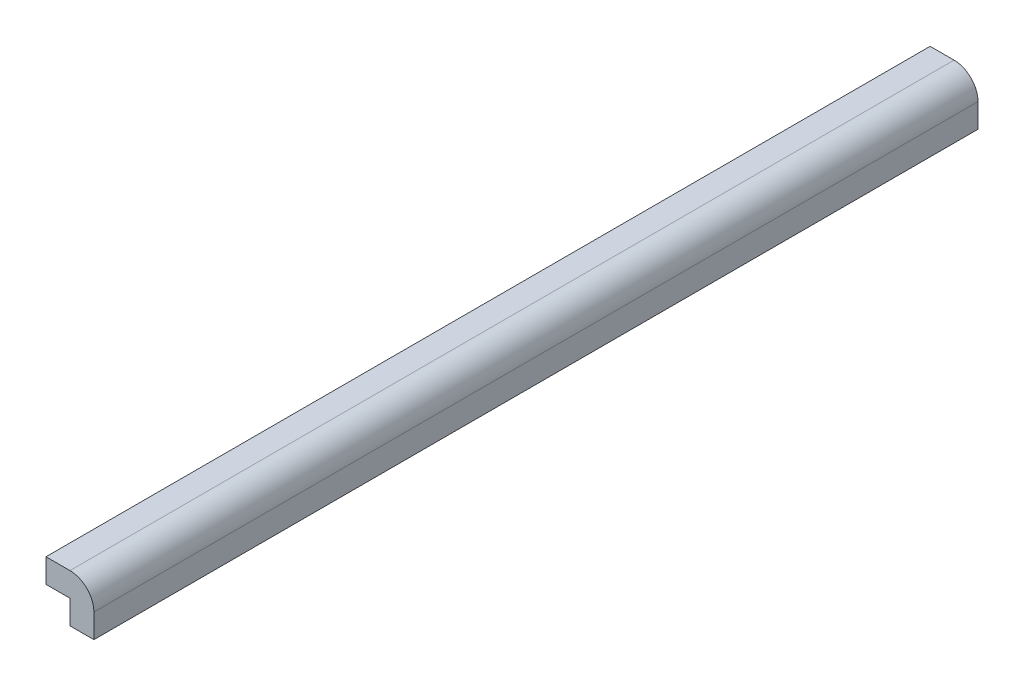
ISO-10303-21;
HEADER;
FILE_DESCRIPTION(('STEP AP214'),'2;1');
FILE_NAME('part.step','',(''),(''),'','','');
FILE_SCHEMA(('AUTOMOTIVE_DESIGN { 1 0 10303 214 1 1 1 1 }'));
ENDSEC;
DATA;
#1=APPLICATION_CONTEXT('core data for automotive mechanical design processes');
#2=APPLICATION_PROTOCOL_DEFINITION('international standard','automotive_design',2000,#1);
#3=PRODUCT_CONTEXT('',#1,'mechanical');
#4=PRODUCT('Part','Part','',(#3));
#5=PRODUCT_RELATED_PRODUCT_CATEGORY('part','',(#4));
#6=PRODUCT_DEFINITION_FORMATION('','',#4);
#7=PRODUCT_DEFINITION_CONTEXT('part definition',#1,'design');
#8=PRODUCT_DEFINITION('design','',#6,#7);
#9=PRODUCT_DEFINITION_SHAPE('','',#8);
#10=(LENGTH_UNIT() NAMED_UNIT(*) SI_UNIT(.MILLI.,.METRE.));
#11=(NAMED_UNIT(*) PLANE_ANGLE_UNIT() SI_UNIT($,.RADIAN.));
#12=(NAMED_UNIT(*) SI_UNIT($,.STERADIAN.) SOLID_ANGLE_UNIT());
#13=UNCERTAINTY_MEASURE_WITH_UNIT(LENGTH_MEASURE(1.E-05),#10,'distance_accuracy_value','');
#14=(GEOMETRIC_REPRESENTATION_CONTEXT(3) GLOBAL_UNCERTAINTY_ASSIGNED_CONTEXT((#13)) GLOBAL_UNIT_ASSIGNED_CONTEXT((#10,
#11,#12)) REPRESENTATION_CONTEXT('',''));
#15=CARTESIAN_POINT('',(0.,0.,0.));
#16=DIRECTION('',(0.,0.,1.));
#17=DIRECTION('',(1.,0.,0.));
#18=AXIS2_PLACEMENT_3D('',#15,#16,#17);
#19=CARTESIAN_POINT('',(0.,0.,480.));
#20=DIRECTION('',(1.,0.,0.));
#21=DIRECTION('',(0.,1.,0.));
#22=AXIS2_PLACEMENT_3D('',#19,#20,#21);
#23=PLANE('',#22);
#24=DIRECTION('',(0.,-1.,0.));
#25=VECTOR('',#24,1.);
#26=CARTESIAN_POINT('',(0.,0.,0.));
#27=LINE('',#26,#25);
#28=CARTESIAN_POINT('',(0.,0.,0.));
#29=VERTEX_POINT('',#28);
#30=CARTESIAN_POINT('',(0.,-13.,0.));
#31=VERTEX_POINT('',#30);
#32=EDGE_CURVE('E129',#29,#31,#27,.T.);
#33=ORIENTED_EDGE('',*,*,#32,.T.);
#34=DIRECTION('',(0.,0.,-1.));
#35=VECTOR('',#34,1.);
#36=CARTESIAN_POINT('',(0.,-13.,480.));
#37=LINE('',#36,#35);
#38=CARTESIAN_POINT('',(0.,-13.,480.));
#39=VERTEX_POINT('',#38);
#40=EDGE_CURVE('E11',#39,#31,#37,.T.);
#41=ORIENTED_EDGE('',*,*,#40,.F.);
#42=DIRECTION('',(0.,-1.,0.));
#43=VECTOR('',#42,1.);
#44=CARTESIAN_POINT('',(0.,0.,480.));
#45=LINE('',#44,#43);
#46=CARTESIAN_POINT('',(0.,0.,480.));
#47=VERTEX_POINT('',#46);
#48=EDGE_CURVE('E141',#47,#39,#45,.T.);
#49=ORIENTED_EDGE('',*,*,#48,.F.);
#50=DIRECTION('',(0.,0.,-1.));
#51=VECTOR('',#50,1.);
#52=CARTESIAN_POINT('',(0.,0.,480.));
#53=LINE('',#52,#51);
#54=EDGE_CURVE('E125',#47,#29,#53,.T.);
#55=ORIENTED_EDGE('',*,*,#54,.T.);
#56=EDGE_LOOP('',(#33,#41,#49,#55));
#57=FACE_BOUND('',#56,.T.);
#58=ADVANCED_FACE('F39',(#57),#23,.F.);
#59=CARTESIAN_POINT('',(0.,-13.,480.));
#60=DIRECTION('',(0.,1.,0.));
#61=DIRECTION('',(0.,0.,1.));
#62=AXIS2_PLACEMENT_3D('',#59,#60,#61);
#63=PLANE('',#62);
#64=DIRECTION('',(1.,0.,0.));
#65=VECTOR('',#64,1.);
#66=CARTESIAN_POINT('',(0.,-13.,0.));
#67=LINE('',#66,#65);
#68=CARTESIAN_POINT('',(13.,-13.,0.));
#69=VERTEX_POINT('',#68);
#70=EDGE_CURVE('E132',#31,#69,#67,.T.);
#71=ORIENTED_EDGE('',*,*,#70,.T.);
#72=DIRECTION('',(0.,0.,-1.));
#73=VECTOR('',#72,1.);
#74=CARTESIAN_POINT('',(13.,-13.,480.));
#75=LINE('',#74,#73);
#76=CARTESIAN_POINT('',(13.,-13.,480.));
#77=VERTEX_POINT('',#76);
#78=EDGE_CURVE('E47',#77,#69,#75,.T.);
#79=ORIENTED_EDGE('',*,*,#78,.F.);
#80=DIRECTION('',(1.,0.,0.));
#81=VECTOR('',#80,1.);
#82=CARTESIAN_POINT('',(0.,-13.,480.));
#83=LINE('',#82,#81);
#84=EDGE_CURVE('E95',#39,#77,#83,.T.);
#85=ORIENTED_EDGE('',*,*,#84,.F.);
#86=ORIENTED_EDGE('',*,*,#40,.T.);
#87=EDGE_LOOP('',(#71,#79,#85,#86));
#88=FACE_BOUND('',#87,.T.);
#89=ADVANCED_FACE('F166',(#88),#63,.F.);
#90=CARTESIAN_POINT('',(13.,0.,480.));
#91=DIRECTION('',(-1.,0.,0.));
#92=DIRECTION('',(0.,-1.,0.));
#93=AXIS2_PLACEMENT_3D('',#90,#91,#92);
#94=PLANE('',#93);
#95=DIRECTION('',(0.,1.,0.));
#96=VECTOR('',#95,1.);
#97=CARTESIAN_POINT('',(13.,0.,0.));
#98=LINE('',#97,#96);
#99=CARTESIAN_POINT('',(13.,0.,0.));
#100=VERTEX_POINT('',#99);
#101=EDGE_CURVE('E134',#69,#100,#98,.T.);
#102=ORIENTED_EDGE('',*,*,#101,.T.);
#103=DIRECTION('',(0.,0.,-1.));
#104=VECTOR('',#103,1.);
#105=CARTESIAN_POINT('',(13.,0.,480.));
#106=LINE('',#105,#104);
#107=CARTESIAN_POINT('',(13.,0.,480.));
#108=VERTEX_POINT('',#107);
#109=EDGE_CURVE('E145',#108,#100,#106,.T.);
#110=ORIENTED_EDGE('',*,*,#109,.F.);
#111=DIRECTION('',(0.,1.,0.));
#112=VECTOR('',#111,1.);
#113=CARTESIAN_POINT('',(13.,0.,480.));
#114=LINE('',#113,#112);
#115=EDGE_CURVE('E153',#77,#108,#114,.T.);
#116=ORIENTED_EDGE('',*,*,#115,.F.);
#117=ORIENTED_EDGE('',*,*,#78,.T.);
#118=EDGE_LOOP('',(#102,#110,#116,#117));
#119=FACE_BOUND('',#118,.T.);
#120=ADVANCED_FACE('F151',(#119),#94,.F.);
#121=CARTESIAN_POINT('',(0.,0.,480.));
#122=DIRECTION('',(0.,0.,-1.));
#123=DIRECTION('',(-1.,0.,0.));
#124=AXIS2_PLACEMENT_3D('',#121,#122,#123);
#125=CYLINDRICAL_SURFACE('',#124,13.);
#126=CARTESIAN_POINT('',(0.,0.,0.));
#127=DIRECTION('',(0.,0.,1.));
#128=DIRECTION('',(-1.,0.,0.));
#129=AXIS2_PLACEMENT_3D('',#126,#127,#128);
#130=CIRCLE('',#129,13.);
#131=CARTESIAN_POINT('',(0.,13.,0.));
#132=VERTEX_POINT('',#131);
#133=EDGE_CURVE('E136',#100,#132,#130,.T.);
#134=ORIENTED_EDGE('',*,*,#133,.T.);
#135=DIRECTION('',(0.,0.,-1.));
#136=VECTOR('',#135,1.);
#137=CARTESIAN_POINT('',(0.,13.,480.));
#138=LINE('',#137,#136);
#139=CARTESIAN_POINT('',(0.,13.,480.));
#140=VERTEX_POINT('',#139);
#141=EDGE_CURVE('E120',#140,#132,#138,.T.);
#142=ORIENTED_EDGE('',*,*,#141,.F.);
#143=CARTESIAN_POINT('',(0.,0.,480.));
#144=DIRECTION('',(0.,0.,1.));
#145=DIRECTION('',(-1.,0.,0.));
#146=AXIS2_PLACEMENT_3D('',#143,#144,#145);
#147=CIRCLE('',#146,13.);
#148=EDGE_CURVE('E111',#108,#140,#147,.T.);
#149=ORIENTED_EDGE('',*,*,#148,.F.);
#150=ORIENTED_EDGE('',*,*,#109,.T.);
#151=EDGE_LOOP('',(#134,#142,#149,#150));
#152=FACE_BOUND('',#151,.T.);
#153=ADVANCED_FACE('F159',(#152),#125,.T.);
#154=CARTESIAN_POINT('',(0.,13.,480.));
#155=DIRECTION('',(0.,-1.,0.));
#156=DIRECTION('',(1.,0.,0.));
#157=AXIS2_PLACEMENT_3D('',#154,#155,#156);
#158=PLANE('',#157);
#159=DIRECTION('',(-1.,0.,0.));
#160=VECTOR('',#159,1.);
#161=CARTESIAN_POINT('',(0.,13.,0.));
#162=LINE('',#161,#160);
#163=CARTESIAN_POINT('',(-13.,13.,0.));
#164=VERTEX_POINT('',#163);
#165=EDGE_CURVE('E119',#132,#164,#162,.T.);
#166=ORIENTED_EDGE('',*,*,#165,.T.);
#167=DIRECTION('',(0.,0.,-1.));
#168=VECTOR('',#167,1.);
#169=CARTESIAN_POINT('',(-13.,13.,480.));
#170=LINE('',#169,#168);
#171=CARTESIAN_POINT('',(-13.,13.,480.));
#172=VERTEX_POINT('',#171);
#173=EDGE_CURVE('E116',#172,#164,#170,.T.);
#174=ORIENTED_EDGE('',*,*,#173,.F.);
#175=DIRECTION('',(-1.,0.,0.));
#176=VECTOR('',#175,1.);
#177=CARTESIAN_POINT('',(0.,13.,480.));
#178=LINE('',#177,#176);
#179=EDGE_CURVE('E105',#140,#172,#178,.T.);
#180=ORIENTED_EDGE('',*,*,#179,.F.);
#181=ORIENTED_EDGE('',*,*,#141,.T.);
#182=EDGE_LOOP('',(#166,#174,#180,#181));
#183=FACE_BOUND('',#182,.T.);
#184=ADVANCED_FACE('F117',(#183),#158,.F.);
#185=CARTESIAN_POINT('',(-13.,0.,480.));
#186=DIRECTION('',(1.,0.,0.));
#187=DIRECTION('',(0.,0.,-1.));
#188=AXIS2_PLACEMENT_3D('',#185,#186,#187);
#189=PLANE('',#188);
#190=DIRECTION('',(0.,-1.,0.));
#191=VECTOR('',#190,1.);
#192=CARTESIAN_POINT('',(-13.,0.,0.));
#193=LINE('',#192,#191);
#194=CARTESIAN_POINT('',(-13.,0.,0.));
#195=VERTEX_POINT('',#194);
#196=EDGE_CURVE('E81',#164,#195,#193,.T.);
#197=ORIENTED_EDGE('',*,*,#196,.T.);
#198=DIRECTION('',(0.,0.,-1.));
#199=VECTOR('',#198,1.);
#200=CARTESIAN_POINT('',(-13.,0.,480.));
#201=LINE('',#200,#199);
#202=CARTESIAN_POINT('',(-13.,0.,480.));
#203=VERTEX_POINT('',#202);
#204=EDGE_CURVE('E121',#203,#195,#201,.T.);
#205=ORIENTED_EDGE('',*,*,#204,.F.);
#206=DIRECTION('',(0.,-1.,0.));
#207=VECTOR('',#206,1.);
#208=CARTESIAN_POINT('',(-13.,0.,480.));
#209=LINE('',#208,#207);
#210=EDGE_CURVE('E109',#172,#203,#209,.T.);
#211=ORIENTED_EDGE('',*,*,#210,.F.);
#212=ORIENTED_EDGE('',*,*,#173,.T.);
#213=EDGE_LOOP('',(#197,#205,#211,#212));
#214=FACE_BOUND('',#213,.T.);
#215=ADVANCED_FACE('F123',(#214),#189,.F.);
#216=CARTESIAN_POINT('',(0.,0.,480.));
#217=DIRECTION('',(0.,1.,0.));
#218=DIRECTION('',(0.,0.,1.));
#219=AXIS2_PLACEMENT_3D('',#216,#217,#218);
#220=PLANE('',#219);
#221=DIRECTION('',(1.,0.,0.));
#222=VECTOR('',#221,1.);
#223=CARTESIAN_POINT('',(0.,0.,0.));
#224=LINE('',#223,#222);
#225=EDGE_CURVE('E87',#195,#29,#224,.T.);
#226=ORIENTED_EDGE('',*,*,#225,.T.);
#227=ORIENTED_EDGE('',*,*,#54,.F.);
#228=DIRECTION('',(1.,0.,0.));
#229=VECTOR('',#228,1.);
#230=CARTESIAN_POINT('',(0.,0.,480.));
#231=LINE('',#230,#229);
#232=EDGE_CURVE('E55',#203,#47,#231,.T.);
#233=ORIENTED_EDGE('',*,*,#232,.F.);
#234=ORIENTED_EDGE('',*,*,#204,.T.);
#235=EDGE_LOOP('',(#226,#227,#233,#234));
#236=FACE_BOUND('',#235,.T.);
#237=ADVANCED_FACE('F180',(#236),#220,.F.);
#238=CARTESIAN_POINT('',(0.,0.,480.));
#239=DIRECTION('',(0.,0.,-1.));
#240=DIRECTION('',(-1.,0.,0.));
#241=AXIS2_PLACEMENT_3D('',#238,#239,#240);
#242=PLANE('',#241);
#243=ORIENTED_EDGE('',*,*,#48,.T.);
#244=ORIENTED_EDGE('',*,*,#84,.T.);
#245=ORIENTED_EDGE('',*,*,#115,.T.);
#246=ORIENTED_EDGE('',*,*,#148,.T.);
#247=ORIENTED_EDGE('',*,*,#179,.T.);
#248=ORIENTED_EDGE('',*,*,#210,.T.);
#249=ORIENTED_EDGE('',*,*,#232,.T.);
#250=EDGE_LOOP('',(#243,#244,#245,#246,#247,#248,#249));
#251=FACE_BOUND('',#250,.T.);
#252=ADVANCED_FACE('F107',(#251),#242,.F.);
#253=CARTESIAN_POINT('',(0.,0.,0.));
#254=DIRECTION('',(0.,0.,-1.));
#255=DIRECTION('',(-1.,0.,0.));
#256=AXIS2_PLACEMENT_3D('',#253,#254,#255);
#257=PLANE('',#256);
#258=ORIENTED_EDGE('',*,*,#32,.F.);
#259=ORIENTED_EDGE('',*,*,#225,.F.);
#260=ORIENTED_EDGE('',*,*,#196,.F.);
#261=ORIENTED_EDGE('',*,*,#165,.F.);
#262=ORIENTED_EDGE('',*,*,#133,.F.);
#263=ORIENTED_EDGE('',*,*,#101,.F.);
#264=ORIENTED_EDGE('',*,*,#70,.F.);
#265=EDGE_LOOP('',(#258,#259,#260,#261,#262,#263,#264));
#266=FACE_BOUND('',#265,.T.);
#267=ADVANCED_FACE('F157',(#266),#257,.T.);
#268=CLOSED_SHELL('',(#58,#89,#120,#153,#184,#215,#237,#252,#267));
#269=MANIFOLD_SOLID_BREP('B2',#268);
#270=ADVANCED_BREP_SHAPE_REPRESENTATION('',(#18,#269),#14);
#271=SHAPE_DEFINITION_REPRESENTATION(#9,#270);
ENDSEC;
END-ISO-10303-21;
